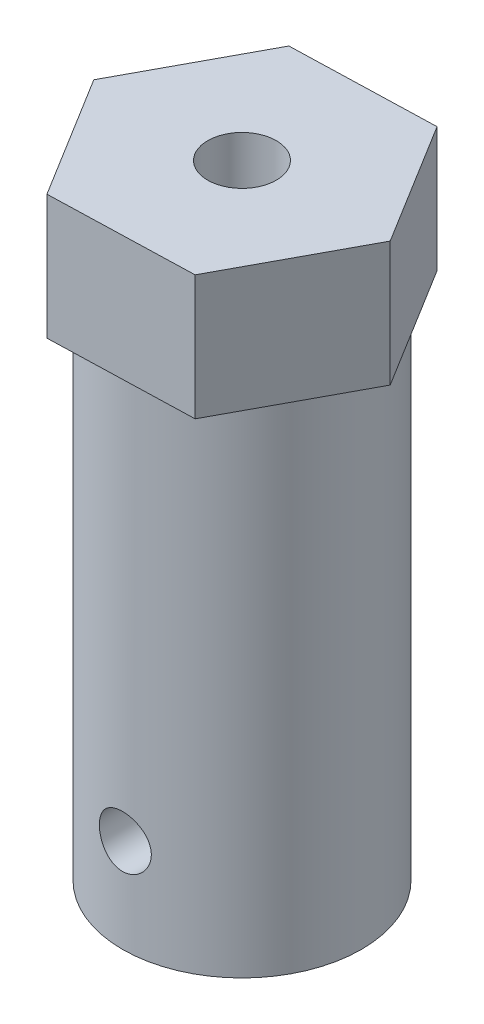
ISO-10303-21;
HEADER;
FILE_DESCRIPTION(('STEP AP214'),'2;1');
FILE_NAME('part.step','',(''),(''),'','','');
FILE_SCHEMA(('AUTOMOTIVE_DESIGN { 1 0 10303 214 1 1 1 1 }'));
ENDSEC;
DATA;
#1=APPLICATION_CONTEXT('core data for automotive mechanical design processes');
#2=APPLICATION_PROTOCOL_DEFINITION('international standard','automotive_design',2000,#1);
#3=PRODUCT_CONTEXT('',#1,'mechanical');
#4=PRODUCT('Part','Part','',(#3));
#5=PRODUCT_RELATED_PRODUCT_CATEGORY('part','',(#4));
#6=PRODUCT_DEFINITION_FORMATION('','',#4);
#7=PRODUCT_DEFINITION_CONTEXT('part definition',#1,'design');
#8=PRODUCT_DEFINITION('design','',#6,#7);
#9=PRODUCT_DEFINITION_SHAPE('','',#8);
#10=(LENGTH_UNIT() NAMED_UNIT(*) SI_UNIT(.MILLI.,.METRE.));
#11=(NAMED_UNIT(*) PLANE_ANGLE_UNIT() SI_UNIT($,.RADIAN.));
#12=(NAMED_UNIT(*) SI_UNIT($,.STERADIAN.) SOLID_ANGLE_UNIT());
#13=UNCERTAINTY_MEASURE_WITH_UNIT(LENGTH_MEASURE(1.E-05),#10,'distance_accuracy_value','');
#14=(GEOMETRIC_REPRESENTATION_CONTEXT(3) GLOBAL_UNCERTAINTY_ASSIGNED_CONTEXT((#13)) GLOBAL_UNIT_ASSIGNED_CONTEXT((#10,
#11,#12)) REPRESENTATION_CONTEXT('',''));
#15=CARTESIAN_POINT('',(0.,0.,0.));
#16=DIRECTION('',(0.,0.,1.));
#17=DIRECTION('',(1.,0.,0.));
#18=AXIS2_PLACEMENT_3D('',#15,#16,#17);
#19=CARTESIAN_POINT('',(0.,0.,0.));
#20=DIRECTION('',(0.,1.,0.));
#21=DIRECTION('',(0.,0.,1.));
#22=AXIS2_PLACEMENT_3D('',#19,#20,#21);
#23=PLANE('',#22);
#24=CARTESIAN_POINT('',(0.,0.,0.));
#25=DIRECTION('',(0.,1.,0.));
#26=DIRECTION('',(0.,0.,1.));
#27=AXIS2_PLACEMENT_3D('',#24,#25,#26);
#28=CIRCLE('',#27,5.75);
#29=CARTESIAN_POINT('',(0.,0.,5.75));
#30=VERTEX_POINT('',#29);
#31=EDGE_CURVE('E55',#30,#30,#28,.T.);
#32=ORIENTED_EDGE('',*,*,#31,.F.);
#33=EDGE_LOOP('',(#32));
#34=FACE_BOUND('',#33,.T.);
#35=CARTESIAN_POINT('',(0.,0.,0.));
#36=DIRECTION('',(0.,1.,0.));
#37=DIRECTION('',(0.,0.,1.));
#38=AXIS2_PLACEMENT_3D('',#35,#36,#37);
#39=CIRCLE('',#38,3.);
#40=CARTESIAN_POINT('',(0.,0.,3.));
#41=VERTEX_POINT('',#40);
#42=EDGE_CURVE('E160',#41,#41,#39,.T.);
#43=ORIENTED_EDGE('',*,*,#42,.T.);
#44=EDGE_LOOP('',(#43));
#45=FACE_BOUND('',#44,.T.);
#46=ADVANCED_FACE('F39',(#34,#45),#23,.F.);
#47=CARTESIAN_POINT('',(0.,24.,0.));
#48=DIRECTION('',(0.,-1.,0.));
#49=DIRECTION('',(0.,0.,-1.));
#50=AXIS2_PLACEMENT_3D('',#47,#48,#49);
#51=CYLINDRICAL_SURFACE('',#50,5.75);
#52=CARTESIAN_POINT('',(1.24999999999999,4.5,5.61248608016091));
#53=CARTESIAN_POINT('',(1.24999760175902,4.43068296184643,5.61248748096109));
#54=CARTESIAN_POINT('',(1.24421457008386,4.36133699814307,5.61378421549666));
#55=CARTESIAN_POINT('',(1.22126011086242,4.22461637882432,5.61882165269733));
#56=CARTESIAN_POINT('',(1.20408038483284,4.15724319703947,5.62256413620073));
#57=CARTESIAN_POINT('',(1.1588984081564,4.02646565959456,5.63204963915259));
#58=CARTESIAN_POINT('',(1.13090794981826,3.96305706663709,5.63779047813056));
#59=CARTESIAN_POINT('',(1.06493269459989,3.8418346268662,5.65062322199733));
#60=CARTESIAN_POINT('',(1.02694812947422,3.78402065036105,5.65771509555576));
#61=CARTESIAN_POINT('',(0.941387199528644,3.67466267604674,5.67258306017403));
#62=CARTESIAN_POINT('',(0.893675607269232,3.62322563850715,5.68036781307722));
#63=CARTESIAN_POINT('',(0.790306917449298,3.52901819345671,5.69566852905388));
#64=CARTESIAN_POINT('',(0.734649207492066,3.48624845453826,5.7031844713546));
#65=CARTESIAN_POINT('',(0.616251730709439,3.41016718516374,5.71719498458548));
#66=CARTESIAN_POINT('',(0.553444449073328,3.37695843887916,5.72367814390655));
#67=CARTESIAN_POINT('',(0.422976308560851,3.32160668166204,5.73479481310162));
#68=CARTESIAN_POINT('',(0.355315988526428,3.2994624443846,5.73942852794901));
#69=CARTESIAN_POINT('',(0.21817438013681,3.26720444923619,5.74626300546532));
#70=CARTESIAN_POINT('',(0.148737517657369,3.25690969698164,5.74850033377872));
#71=CARTESIAN_POINT('',(0.00908864940746421,3.24807709639121,5.75041661094106));
#72=CARTESIAN_POINT('',(-0.0611232678244194,3.2495379187537,5.75009584905479));
#73=CARTESIAN_POINT('',(-0.19908176075318,3.26404001586474,5.74696006103956));
#74=CARTESIAN_POINT('',(-0.26684993862716,3.27688621089837,5.74418705402808));
#75=CARTESIAN_POINT('',(-0.399245052071153,3.31348363834528,5.73650619438593));
#76=CARTESIAN_POINT('',(-0.463871846607452,3.33723535986758,5.7315982460044));
#77=CARTESIAN_POINT('',(-0.588692323977611,3.39514277539871,5.72013127098854));
#78=CARTESIAN_POINT('',(-0.648850497027308,3.42937259876247,5.71356054002011));
#79=CARTESIAN_POINT('',(-0.76264013055773,3.50720931257799,5.69948875500368));
#80=CARTESIAN_POINT('',(-0.816270710503977,3.55081746592165,5.69198757571856));
#81=CARTESIAN_POINT('',(-0.916642826138088,3.64723562771628,5.67669800906149));
#82=CARTESIAN_POINT('',(-0.963220078671666,3.70021637139066,5.6689068874812));
#83=CARTESIAN_POINT('',(-1.04685895715123,3.81331725840589,5.65406013853686));
#84=CARTESIAN_POINT('',(-1.08392033147223,3.87343759047487,5.64700453062468));
#85=CARTESIAN_POINT('',(-1.14754721031011,3.99937447231439,5.63442058541642));
#86=CARTESIAN_POINT('',(-1.17408199706099,4.06520701955582,5.62889673186602));
#87=CARTESIAN_POINT('',(-1.21566278528879,4.20054515048658,5.62006410398923));
#88=CARTESIAN_POINT('',(-1.23071058472624,4.27005015753528,5.61675498301956));
#89=CARTESIAN_POINT('',(-1.2486361117677,4.40925999150907,5.6127970987734));
#90=CARTESIAN_POINT('',(-1.25175290288891,4.47893258539712,5.61209608459876));
#91=CARTESIAN_POINT('',(-1.24637488516898,4.61780186872962,5.61329288738228));
#92=CARTESIAN_POINT('',(-1.2378808635385,4.68699859011844,5.6151905281522));
#93=CARTESIAN_POINT('',(-1.20972965508196,4.82212160819509,5.62132151362112));
#94=CARTESIAN_POINT('',(-1.19020384987401,4.88807663972778,5.62552735254737));
#95=CARTESIAN_POINT('',(-1.14068546407925,5.01577899383204,5.63577608050672));
#96=CARTESIAN_POINT('',(-1.11069189170847,5.07752591703738,5.64181914360333));
#97=CARTESIAN_POINT('',(-1.040561612131,5.19609468941834,5.65517640870419));
#98=CARTESIAN_POINT('',(-1.00027746608422,5.25282726927895,5.66250855855328));
#99=CARTESIAN_POINT('',(-0.910902746534963,5.35881481107359,5.67757037394609));
#100=CARTESIAN_POINT('',(-0.861811093381068,5.40806885489739,5.68530008814152));
#101=CARTESIAN_POINT('',(-0.755133725075515,5.49862751418985,5.70045813036014));
#102=CARTESIAN_POINT('',(-0.697408378720643,5.53976924175179,5.70787829932773));
#103=CARTESIAN_POINT('',(-0.575726899511278,5.61177126760472,5.7214316783188));
#104=CARTESIAN_POINT('',(-0.511771055898407,5.64263204288004,5.72756494804304));
#105=CARTESIAN_POINT('',(-0.379839991982069,5.69296851224918,5.73781903900349));
#106=CARTESIAN_POINT('',(-0.311893120895245,5.71251581946798,5.7419524909196));
#107=CARTESIAN_POINT('',(-0.173580109499774,5.73989437114607,5.74779579806779));
#108=CARTESIAN_POINT('',(-0.103214317857041,5.74772729694571,5.7495060011018));
#109=CARTESIAN_POINT('',(0.0363920861427784,5.75137991384358,5.75029994562711));
#110=CARTESIAN_POINT('',(0.105626141992073,5.74744292595131,5.74943688552911));
#111=CARTESIAN_POINT('',(0.242420679508131,5.72821121185753,5.74529509961069));
#112=CARTESIAN_POINT('',(0.309981190526998,5.7129166850005,5.74201641618866));
#113=CARTESIAN_POINT('',(0.441325345429479,5.67152004722863,5.73341553673506));
#114=CARTESIAN_POINT('',(0.505120193765912,5.64545205938541,5.72809979656158));
#115=CARTESIAN_POINT('',(0.627463117633281,5.58328189579532,5.71599278629122));
#116=CARTESIAN_POINT('',(0.686010689871312,5.54717875888551,5.70920137486869));
#117=CARTESIAN_POINT('',(0.797385198849451,5.465167704943,5.69472504901097));
#118=CARTESIAN_POINT('',(0.850084117233428,5.41908845582244,5.68702575501951));
#119=CARTESIAN_POINT('',(0.947084699131781,5.31877927382973,5.67167946381507));
#120=CARTESIAN_POINT('',(0.991384338610196,5.2645473819859,5.66403247963441));
#121=CARTESIAN_POINT('',(1.07089047065235,5.14861342572913,5.64954445311031));
#122=CARTESIAN_POINT('',(1.10596950268022,5.08682237378893,5.64271535335214));
#123=CARTESIAN_POINT('',(1.16518968031949,4.95808718086018,5.63078614292552));
#124=CARTESIAN_POINT('',(1.18934013275368,4.8911474815424,5.62568456203052));
#125=CARTESIAN_POINT('',(1.2216782905918,4.7701109875964,5.61873681728447));
#126=CARTESIAN_POINT('',(1.2322786662895,4.7166733902261,5.61640827090507));
#127=CARTESIAN_POINT('',(1.24644029510223,4.60882977483622,5.61328238883723));
#128=CARTESIAN_POINT('',(1.25000188296265,4.55442380299405,5.61248498033214));
#129=CARTESIAN_POINT('',(1.24999999999999,4.5,5.61248608016091));
#130=B_SPLINE_CURVE_WITH_KNOTS('',3,(#52,#53,#54,#55,#56,#57,#58,#59,#60,#61,#62,#63,#64,#65,
#66,#67,#68,#69,#70,#71,#72,#73,#74,#75,#76,#77,#78,#79,#80,#81,#82,#83,#84,#85,#86,#87,#88,#89,
#90,#91,#92,#93,#94,#95,#96,#97,#98,#99,#100,#101,#102,#103,#104,#105,#106,#107,#108,#109,#110,
#111,#112,#113,#114,#115,#116,#117,#118,#119,#120,#121,#122,#123,#124,#125,#126,#127,#128,#129),
.UNSPECIFIED.,.T.,.F.,(4,2,2,2,2,2,2,2,2,2,2,2,2,2,2,2,2,2,2,2,2,2,2,2,2,2,2,2,2,2,2,2,2,2,2,2,
2,2,4),(0.,0.207751669325756,0.415654778957708,0.623331746184184,0.831003897988611,
1.04178860079159,1.25258955726905,1.46557862294375,1.67854407654251,1.88821152973921,
2.09785527440792,2.30397491643876,2.51010380376594,2.71772608059428,2.92537633349732,
3.13729528259188,3.34921983480672,3.56175833620002,3.77426356392283,3.98248779787275,
4.19069791496372,4.3964791236714,4.60227983471728,4.811213017446,5.02017182937093,
5.23297426277709,5.44576682184841,5.65719726336087,5.86859735579661,6.07565757195403,
6.28271415393183,6.48911988588624,6.69554539412311,6.90584589920715,7.11619701771825,
7.32931887187706,7.5422588874553,7.70538146128842,7.86849627727378),.UNSPECIFIED.);
#131=CARTESIAN_POINT('',(1.24999999999999,4.5,5.61248608016091));
#132=VERTEX_POINT('',#131);
#133=EDGE_CURVE('E154',#132,#132,#130,.T.);
#134=ORIENTED_EDGE('',*,*,#133,.T.);
#135=EDGE_LOOP('',(#134));
#136=FACE_BOUND('',#135,.T.);
#137=CARTESIAN_POINT('',(0.,24.,0.));
#138=DIRECTION('',(0.,1.,0.));
#139=DIRECTION('',(0.,0.,1.));
#140=AXIS2_PLACEMENT_3D('',#137,#138,#139);
#141=CIRCLE('',#140,5.75);
#142=CARTESIAN_POINT('',(0.,24.,5.75));
#143=VERTEX_POINT('',#142);
#144=EDGE_CURVE('E11',#143,#143,#141,.T.);
#145=ORIENTED_EDGE('',*,*,#144,.F.);
#146=EDGE_LOOP('',(#145));
#147=FACE_BOUND('',#146,.T.);
#148=ORIENTED_EDGE('',*,*,#31,.T.);
#149=EDGE_LOOP('',(#148));
#150=FACE_BOUND('',#149,.T.);
#151=ADVANCED_FACE('F41',(#136,#147,#150),#51,.T.);
#152=CARTESIAN_POINT('',(0.,24.,0.));
#153=DIRECTION('',(0.,-1.,0.));
#154=DIRECTION('',(0.,0.,-1.));
#155=AXIS2_PLACEMENT_3D('',#152,#153,#154);
#156=CYLINDRICAL_SURFACE('',#155,3.);
#157=CARTESIAN_POINT('',(1.24999999999999,4.5,2.72717802865893));
#158=CARTESIAN_POINT('',(1.24999259066567,4.43332810910315,2.7271851956322));
#159=CARTESIAN_POINT('',(1.24463203881502,4.36654734317378,2.72965859534401));
#160=CARTESIAN_POINT('',(1.22339678947784,4.23491305794286,2.73923833650884));
#161=CARTESIAN_POINT('',(1.20749354003276,4.17006527332477,2.74635725824267));
#162=CARTESIAN_POINT('',(1.1658998841945,4.04443887030893,2.76426917574768));
#163=CARTESIAN_POINT('',(1.14024937431427,3.98364483628499,2.77504717562616));
#164=CARTESIAN_POINT('',(1.08000637754462,3.86724055042195,2.79904148565793));
#165=CARTESIAN_POINT('',(1.04541600591531,3.81162907656688,2.81225721880783));
#166=CARTESIAN_POINT('',(0.965973882676161,3.70367427502653,2.84055762619857));
#167=CARTESIAN_POINT('',(0.920653238184404,3.65169244125591,2.85570568079146));
#168=CARTESIAN_POINT('',(0.822021675745545,3.55579977750245,2.88564295372227));
#169=CARTESIAN_POINT('',(0.768707691374,3.51189205938699,2.90043203180789));
#170=CARTESIAN_POINT('',(0.652763393797344,3.43155046912073,2.92875537930613));
#171=CARTESIAN_POINT('',(0.589829293683656,3.39552337196766,2.94220739975291));
#172=CARTESIAN_POINT('',(0.45813202236235,3.3347239794944,2.96556519993426));
#173=CARTESIAN_POINT('',(0.389371454872122,3.30994668803579,2.97547255347157));
#174=CARTESIAN_POINT('',(0.251768498025164,3.27366054124327,2.99017521042367));
#175=CARTESIAN_POINT('',(0.183116576196079,3.26152830509796,2.99520971127466));
#176=CARTESIAN_POINT('',(0.0445791803650056,3.24886235884015,3.00046828611204));
#177=CARTESIAN_POINT('',(-0.0253057817645166,3.24832394411705,3.00069431131015));
#178=CARTESIAN_POINT('',(-0.159792780112568,3.25853428093333,2.99645129133057));
#179=CARTESIAN_POINT('',(-0.224457488607313,3.26859810052573,2.99226714648664));
#180=CARTESIAN_POINT('',(-0.351082893931455,3.29855310263817,2.98006516750309));
#181=CARTESIAN_POINT('',(-0.413043391054915,3.31844500963017,2.97204705074577));
#182=CARTESIAN_POINT('',(-0.533638118077523,3.36772804089465,2.95279852414029));
#183=CARTESIAN_POINT('',(-0.592207177074904,3.39725946287083,2.94152097126085));
#184=CARTESIAN_POINT('',(-0.70371176728196,3.46484575670035,2.91685713989805));
#185=CARTESIAN_POINT('',(-0.756645297756971,3.50290364084499,2.90347011666255));
#186=CARTESIAN_POINT('',(-0.85934091170792,3.58958242040462,2.87481698777061));
#187=CARTESIAN_POINT('',(-0.908616437316237,3.63875879127901,2.8594849435601));
#188=CARTESIAN_POINT('',(-0.998431414927664,3.74471144070658,2.8293786068147));
#189=CARTESIAN_POINT('',(-1.03896749582431,3.8014906382921,2.8146045313137));
#190=CARTESIAN_POINT('',(-1.11140189250063,3.92339503666191,2.78681612355339));
#191=CARTESIAN_POINT('',(-1.1429725335554,3.98873320574328,2.77387558556715));
#192=CARTESIAN_POINT('',(-1.19446432058391,4.1244810449745,2.75209844221011));
#193=CARTESIAN_POINT('',(-1.21439379627313,4.19488704826955,2.74325890334594));
#194=CARTESIAN_POINT('',(-1.24080025168121,4.333896808914,2.73141212519724));
#195=CARTESIAN_POINT('',(-1.24806614632865,4.40232112225905,2.72806369197117));
#196=CARTESIAN_POINT('',(-1.25125630518998,4.5394784824115,2.72660286810642));
#197=CARTESIAN_POINT('',(-1.24718449318148,4.60821141419171,2.72848866599319));
#198=CARTESIAN_POINT('',(-1.22853477565555,4.73939838543045,2.73693131345749));
#199=CARTESIAN_POINT('',(-1.21464618818048,4.8019726867868,2.74318138016618));
#200=CARTESIAN_POINT('',(-1.17767058564225,4.92385129649787,2.75925630297447));
#201=CARTESIAN_POINT('',(-1.15458142053124,4.98315483683071,2.76908199460161));
#202=CARTESIAN_POINT('',(-1.09877520805186,5.09961531035646,2.79170797857));
#203=CARTESIAN_POINT('',(-1.06569183306197,5.15657497461032,2.80461662202282));
#204=CARTESIAN_POINT('',(-0.991200784385965,5.26440805249902,2.83180003740794));
#205=CARTESIAN_POINT('',(-0.949789507875982,5.31527881670186,2.84607539920583));
#206=CARTESIAN_POINT('',(-0.855844455715499,5.413800134884,2.87578619784533));
#207=CARTESIAN_POINT('',(-0.802679661479733,5.46085139995065,2.89122146708842));
#208=CARTESIAN_POINT('',(-0.688851512553535,5.54547229197933,2.92043361183923));
#209=CARTESIAN_POINT('',(-0.628187608803652,5.5830412240637,2.93421036577014));
#210=CARTESIAN_POINT('',(-0.500654680803381,5.64758987544357,2.9586425158565));
#211=CARTESIAN_POINT('',(-0.433770169638503,5.67454224128947,2.96928983138826));
#212=CARTESIAN_POINT('',(-0.295858835154415,5.71661679233442,2.98618173103366));
#213=CARTESIAN_POINT('',(-0.224834504225193,5.73174601822606,2.9924289351992));
#214=CARTESIAN_POINT('',(-0.08601653350641,5.7488581255203,2.9995153479751));
#215=CARTESIAN_POINT('',(-0.0183440847938972,5.75168599969696,3.00070204534225));
#216=CARTESIAN_POINT('',(0.116486811714285,5.74638685870605,2.99849523480953));
#217=CARTESIAN_POINT('',(0.183645347541155,5.73826176398713,2.99510252984313));
#218=CARTESIAN_POINT('',(0.313086482449184,5.71189392784133,2.98430065981734));
#219=CARTESIAN_POINT('',(0.375457537843568,5.69402031953044,2.97703824209233));
#220=CARTESIAN_POINT('',(0.496292230501329,5.64906575279086,2.95929499847058));
#221=CARTESIAN_POINT('',(0.554755122985825,5.62198304533509,2.94881356124207));
#222=CARTESIAN_POINT('',(0.66902456547878,5.55801047078553,2.92505825398663));
#223=CARTESIAN_POINT('',(0.72459165797668,5.520732698576,2.91167959188766));
#224=CARTESIAN_POINT('',(0.828918675638779,5.4379928171281,2.88371561874231));
#225=CARTESIAN_POINT('',(0.877676061786039,5.39252766959324,2.86912986083797));
#226=CARTESIAN_POINT('',(0.970449787231577,5.29105517414559,2.83914845259141));
#227=CARTESIAN_POINT('',(1.01391775364847,5.23454098537887,2.82376522857896));
#228=CARTESIAN_POINT('',(1.09083332306674,5.1145412593198,2.79495552690186));
#229=CARTESIAN_POINT('',(1.12427532456754,5.05105185194185,2.78153014522558));
#230=CARTESIAN_POINT('',(1.17982766043577,4.91905616497725,2.75842557732643));
#231=CARTESIAN_POINT('',(1.20199823632853,4.85057884120679,2.74872654469865));
#232=CARTESIAN_POINT('',(1.234235564538,4.71046042614933,2.73440803066668));
#233=CARTESIAN_POINT('',(1.24434291521209,4.6388307927257,2.72977151604981));
#234=CARTESIAN_POINT('',(1.24940464923649,4.54464147573811,2.72744979732688));
#235=CARTESIAN_POINT('',(1.25000248121118,4.52232684261196,2.72717562860875));
#236=CARTESIAN_POINT('',(1.24999999999999,4.5,2.72717802865893));
#237=B_SPLINE_CURVE_WITH_KNOTS('',3,(#157,#158,#159,#160,#161,#162,#163,#164,#165,#166,#167,
#168,#169,#170,#171,#172,#173,#174,#175,#176,#177,#178,#179,#180,#181,#182,#183,#184,#185,#186,
#187,#188,#189,#190,#191,#192,#193,#194,#195,#196,#197,#198,#199,#200,#201,#202,#203,#204,#205,
#206,#207,#208,#209,#210,#211,#212,#213,#214,#215,#216,#217,#218,#219,#220,#221,#222,#223,#224,
#225,#226,#227,#228,#229,#230,#231,#232,#233,#234,#235,#236),.UNSPECIFIED.,.T.,.F.,(4,2,2,2,2,2,
2,2,2,2,2,2,2,2,2,2,2,2,2,2,2,2,2,2,2,2,2,2,2,2,2,2,2,2,2,2,2,2,2,4),(0.,0.199951711985514,
0.400447161842174,0.600130652152109,0.799766938550096,1.01066841430653,1.2216510045991,
1.44178476577923,1.6618206677489,1.87040605977951,2.07890680917929,2.27471840245092,
2.47054443201882,2.66935814640064,2.86824221022483,3.08114531844483,3.29413040441365,
3.5141154566672,3.73394290745567,3.93950778306306,4.14500152518447,4.3373390106619,
4.52972146913527,4.73025126818167,4.93086800795463,5.14781662735511,5.36478114041864,
5.58230105955592,5.79969134643005,6.0018863509405,6.20404590801911,6.39903415036485,
6.59405944632169,6.79789862829034,7.00181361048901,7.21960426908074,7.43751638139185,
7.65425125796861,7.87025464546159,7.93721375436702),.UNSPECIFIED.);
#238=CARTESIAN_POINT('',(1.24999999999999,4.5,2.72717802865893));
#239=VERTEX_POINT('',#238);
#240=EDGE_CURVE('E44',#239,#239,#237,.T.);
#241=ORIENTED_EDGE('',*,*,#240,.F.);
#242=EDGE_LOOP('',(#241));
#243=FACE_BOUND('',#242,.T.);
#244=CARTESIAN_POINT('',(0.,24.,0.));
#245=DIRECTION('',(0.,1.,0.));
#246=DIRECTION('',(0.,0.,1.));
#247=AXIS2_PLACEMENT_3D('',#244,#245,#246);
#248=CIRCLE('',#247,3.);
#249=CARTESIAN_POINT('',(0.,24.,3.));
#250=VERTEX_POINT('',#249);
#251=EDGE_CURVE('E153',#250,#250,#248,.T.);
#252=ORIENTED_EDGE('',*,*,#251,.T.);
#253=EDGE_LOOP('',(#252));
#254=FACE_BOUND('',#253,.T.);
#255=ORIENTED_EDGE('',*,*,#42,.F.);
#256=EDGE_LOOP('',(#255));
#257=FACE_BOUND('',#256,.T.);
#258=ADVANCED_FACE('F167',(#243,#254,#257),#156,.F.);
#259=CARTESIAN_POINT('',(0.,4.5,5.75));
#260=DIRECTION('',(0.,0.,1.));
#261=DIRECTION('',(1.,0.,0.));
#262=AXIS2_PLACEMENT_3D('',#259,#260,#261);
#263=CYLINDRICAL_SURFACE('',#262,1.24999999999999);
#264=ORIENTED_EDGE('',*,*,#240,.T.);
#265=EDGE_LOOP('',(#264));
#266=FACE_BOUND('',#265,.T.);
#267=ORIENTED_EDGE('',*,*,#133,.F.);
#268=EDGE_LOOP('',(#267));
#269=FACE_BOUND('',#268,.T.);
#270=ADVANCED_FACE('F162',(#266,#269),#263,.F.);
#271=CARTESIAN_POINT('',(0.,24.,0.));
#272=DIRECTION('',(0.,1.,0.));
#273=DIRECTION('',(0.,0.,1.));
#274=AXIS2_PLACEMENT_3D('',#271,#272,#273);
#275=PLANE('',#274);
#276=CARTESIAN_POINT('',(0.,24.,0.));
#277=DIRECTION('',(0.,1.,0.));
#278=DIRECTION('',(0.,0.,1.));
#279=AXIS2_PLACEMENT_3D('',#276,#277,#278);
#280=CIRCLE('',#279,1.65);
#281=CARTESIAN_POINT('',(0.,24.,1.65));
#282=VERTEX_POINT('',#281);
#283=EDGE_CURVE('E137',#282,#282,#280,.T.);
#284=ORIENTED_EDGE('',*,*,#283,.T.);
#285=EDGE_LOOP('',(#284));
#286=FACE_BOUND('',#285,.T.);
#287=ORIENTED_EDGE('',*,*,#251,.F.);
#288=EDGE_LOOP('',(#287));
#289=FACE_BOUND('',#288,.T.);
#290=ADVANCED_FACE('F166',(#286,#289),#275,.F.);
#291=CARTESIAN_POINT('',(3.63977307715083,30.,5.89508710256668));
#292=DIRECTION('',(-0.880412900339249,0.,-0.474207892085561));
#293=DIRECTION('',(-0.474207892085561,0.,0.880412900339249));
#294=AXIS2_PLACEMENT_3D('',#291,#292,#293);
#295=PLANE('',#294);
#296=DIRECTION('',(0.474207892085561,0.,-0.880412900339249));
#297=VECTOR('',#296,1.);
#298=CARTESIAN_POINT('',(3.63977307715083,24.,5.89508710256668));
#299=LINE('',#298,#297);
#300=CARTESIAN_POINT('',(3.63977307715083,24.,5.89508710256668));
#301=VERTEX_POINT('',#300);
#302=CARTESIAN_POINT('',(6.92518172692016,24.,-0.204592397539939));
#303=VERTEX_POINT('',#302);
#304=EDGE_CURVE('E133',#301,#303,#299,.T.);
#305=ORIENTED_EDGE('',*,*,#304,.T.);
#306=DIRECTION('',(0.,-1.,0.));
#307=VECTOR('',#306,1.);
#308=CARTESIAN_POINT('',(6.92518172692016,30.,-0.204592397539939));
#309=LINE('',#308,#307);
#310=CARTESIAN_POINT('',(6.92518172692016,30.,-0.204592397539939));
#311=VERTEX_POINT('',#310);
#312=EDGE_CURVE('E151',#311,#303,#309,.T.);
#313=ORIENTED_EDGE('',*,*,#312,.F.);
#314=DIRECTION('',(0.474207892085561,0.,-0.880412900339249));
#315=VECTOR('',#314,1.);
#316=CARTESIAN_POINT('',(3.63977307715083,30.,5.89508710256668));
#317=LINE('',#316,#315);
#318=CARTESIAN_POINT('',(3.63977307715083,30.,5.89508710256668));
#319=VERTEX_POINT('',#318);
#320=EDGE_CURVE('E144',#319,#311,#317,.T.);
#321=ORIENTED_EDGE('',*,*,#320,.F.);
#322=DIRECTION('',(0.,-1.,0.));
#323=VECTOR('',#322,1.);
#324=CARTESIAN_POINT('',(3.63977307715083,30.,5.89508710256668));
#325=LINE('',#324,#323);
#326=EDGE_CURVE('E129',#319,#301,#325,.T.);
#327=ORIENTED_EDGE('',*,*,#326,.T.);
#328=EDGE_LOOP('',(#305,#313,#321,#327));
#329=FACE_BOUND('',#328,.T.);
#330=ADVANCED_FACE('F169',(#329),#295,.F.);
#331=CARTESIAN_POINT('',(6.92518172692016,30.,-0.204592397539939));
#332=DIRECTION('',(-0.85088253139079,0.,0.525355991470546));
#333=DIRECTION('',(0.525355991470546,0.,0.85088253139079));
#334=AXIS2_PLACEMENT_3D('',#331,#332,#333);
#335=PLANE('',#334);
#336=DIRECTION('',(-0.525355991470546,0.,-0.85088253139079));
#337=VECTOR('',#336,1.);
#338=CARTESIAN_POINT('',(6.92518172692016,24.,-0.204592397539939));
#339=LINE('',#338,#337);
#340=CARTESIAN_POINT('',(3.28540864976933,24.,-6.09967950010662));
#341=VERTEX_POINT('',#340);
#342=EDGE_CURVE('E136',#303,#341,#339,.T.);
#343=ORIENTED_EDGE('',*,*,#342,.T.);
#344=DIRECTION('',(0.,-1.,0.));
#345=VECTOR('',#344,1.);
#346=CARTESIAN_POINT('',(3.28540864976933,30.,-6.09967950010662));
#347=LINE('',#346,#345);
#348=CARTESIAN_POINT('',(3.28540864976933,30.,-6.09967950010662));
#349=VERTEX_POINT('',#348);
#350=EDGE_CURVE('E148',#349,#341,#347,.T.);
#351=ORIENTED_EDGE('',*,*,#350,.F.);
#352=DIRECTION('',(-0.525355991470546,0.,-0.85088253139079));
#353=VECTOR('',#352,1.);
#354=CARTESIAN_POINT('',(6.92518172692016,30.,-0.204592397539939));
#355=LINE('',#354,#353);
#356=EDGE_CURVE('E102',#311,#349,#355,.T.);
#357=ORIENTED_EDGE('',*,*,#356,.F.);
#358=ORIENTED_EDGE('',*,*,#312,.T.);
#359=EDGE_LOOP('',(#343,#351,#357,#358));
#360=FACE_BOUND('',#359,.T.);
#361=ADVANCED_FACE('F219',(#360),#335,.F.);
#362=CARTESIAN_POINT('',(3.28540864976933,30.,-6.09967950010662));
#363=DIRECTION('',(0.029530368948459,0.,0.999563883556107));
#364=DIRECTION('',(0.999563883556108,0.,-0.029530368948459));
#365=AXIS2_PLACEMENT_3D('',#362,#363,#364);
#366=PLANE('',#365);
#367=DIRECTION('',(-0.999563883556108,0.,0.029530368948459));
#368=VECTOR('',#367,1.);
#369=CARTESIAN_POINT('',(3.28540864976933,24.,-6.09967950010662));
#370=LINE('',#369,#368);
#371=CARTESIAN_POINT('',(-3.63977307715083,24.,-5.89508710256668));
#372=VERTEX_POINT('',#371);
#373=EDGE_CURVE('E139',#341,#372,#370,.T.);
#374=ORIENTED_EDGE('',*,*,#373,.T.);
#375=DIRECTION('',(0.,-1.,0.));
#376=VECTOR('',#375,1.);
#377=CARTESIAN_POINT('',(-3.63977307715083,30.,-5.89508710256668));
#378=LINE('',#377,#376);
#379=CARTESIAN_POINT('',(-3.63977307715083,30.,-5.89508710256668));
#380=VERTEX_POINT('',#379);
#381=EDGE_CURVE('E124',#380,#372,#378,.T.);
#382=ORIENTED_EDGE('',*,*,#381,.F.);
#383=DIRECTION('',(-0.999563883556108,0.,0.029530368948459));
#384=VECTOR('',#383,1.);
#385=CARTESIAN_POINT('',(3.28540864976933,30.,-6.09967950010662));
#386=LINE('',#385,#384);
#387=EDGE_CURVE('E115',#349,#380,#386,.T.);
#388=ORIENTED_EDGE('',*,*,#387,.F.);
#389=ORIENTED_EDGE('',*,*,#350,.T.);
#390=EDGE_LOOP('',(#374,#382,#388,#389));
#391=FACE_BOUND('',#390,.T.);
#392=ADVANCED_FACE('F217',(#391),#366,.F.);
#393=CARTESIAN_POINT('',(-3.63977307715083,30.,-5.89508710256668));
#394=DIRECTION('',(0.880412900339249,0.,0.474207892085561));
#395=DIRECTION('',(0.474207892085561,0.,-0.880412900339249));
#396=AXIS2_PLACEMENT_3D('',#393,#394,#395);
#397=PLANE('',#396);
#398=DIRECTION('',(-0.474207892085561,0.,0.880412900339249));
#399=VECTOR('',#398,1.);
#400=CARTESIAN_POINT('',(-3.63977307715083,24.,-5.89508710256668));
#401=LINE('',#400,#399);
#402=CARTESIAN_POINT('',(-6.92518172692016,24.,0.204592397539942));
#403=VERTEX_POINT('',#402);
#404=EDGE_CURVE('E123',#372,#403,#401,.T.);
#405=ORIENTED_EDGE('',*,*,#404,.T.);
#406=DIRECTION('',(0.,-1.,0.));
#407=VECTOR('',#406,1.);
#408=CARTESIAN_POINT('',(-6.92518172692016,30.,0.204592397539942));
#409=LINE('',#408,#407);
#410=CARTESIAN_POINT('',(-6.92518172692016,30.,0.204592397539942));
#411=VERTEX_POINT('',#410);
#412=EDGE_CURVE('E120',#411,#403,#409,.T.);
#413=ORIENTED_EDGE('',*,*,#412,.F.);
#414=DIRECTION('',(-0.474207892085561,0.,0.880412900339249));
#415=VECTOR('',#414,1.);
#416=CARTESIAN_POINT('',(-3.63977307715083,30.,-5.89508710256668));
#417=LINE('',#416,#415);
#418=EDGE_CURVE('E109',#380,#411,#417,.T.);
#419=ORIENTED_EDGE('',*,*,#418,.F.);
#420=ORIENTED_EDGE('',*,*,#381,.T.);
#421=EDGE_LOOP('',(#405,#413,#419,#420));
#422=FACE_BOUND('',#421,.T.);
#423=ADVANCED_FACE('F121',(#422),#397,.F.);
#424=CARTESIAN_POINT('',(-6.92518172692016,30.,0.204592397539942));
#425=DIRECTION('',(0.85088253139079,0.,-0.525355991470546));
#426=DIRECTION('',(-0.525355991470546,0.,-0.85088253139079));
#427=AXIS2_PLACEMENT_3D('',#424,#425,#426);
#428=PLANE('',#427);
#429=DIRECTION('',(0.525355991470546,0.,0.85088253139079));
#430=VECTOR('',#429,1.);
#431=CARTESIAN_POINT('',(-6.92518172692016,24.,0.204592397539942));
#432=LINE('',#431,#430);
#433=CARTESIAN_POINT('',(-3.28540864976933,24.,6.09967950010662));
#434=VERTEX_POINT('',#433);
#435=EDGE_CURVE('E87',#403,#434,#432,.T.);
#436=ORIENTED_EDGE('',*,*,#435,.T.);
#437=DIRECTION('',(0.,-1.,0.));
#438=VECTOR('',#437,1.);
#439=CARTESIAN_POINT('',(-3.28540864976933,30.,6.09967950010662));
#440=LINE('',#439,#438);
#441=CARTESIAN_POINT('',(-3.28540864976933,30.,6.09967950010662));
#442=VERTEX_POINT('',#441);
#443=EDGE_CURVE('E125',#442,#434,#440,.T.);
#444=ORIENTED_EDGE('',*,*,#443,.F.);
#445=DIRECTION('',(0.525355991470546,0.,0.85088253139079));
#446=VECTOR('',#445,1.);
#447=CARTESIAN_POINT('',(-6.92518172692016,30.,0.204592397539942));
#448=LINE('',#447,#446);
#449=EDGE_CURVE('E113',#411,#442,#448,.T.);
#450=ORIENTED_EDGE('',*,*,#449,.F.);
#451=ORIENTED_EDGE('',*,*,#412,.T.);
#452=EDGE_LOOP('',(#436,#444,#450,#451));
#453=FACE_BOUND('',#452,.T.);
#454=ADVANCED_FACE('F127',(#453),#428,.F.);
#455=CARTESIAN_POINT('',(-3.28540864976933,30.,6.09967950010662));
#456=DIRECTION('',(-0.0295303689484587,0.,-0.999563883556108));
#457=DIRECTION('',(-0.999563883556108,0.,0.0295303689484587));
#458=AXIS2_PLACEMENT_3D('',#455,#456,#457);
#459=PLANE('',#458);
#460=DIRECTION('',(0.999563883556108,0.,-0.0295303689484587));
#461=VECTOR('',#460,1.);
#462=CARTESIAN_POINT('',(-3.28540864976933,24.,6.09967950010662));
#463=LINE('',#462,#461);
#464=EDGE_CURVE('E93',#434,#301,#463,.T.);
#465=ORIENTED_EDGE('',*,*,#464,.T.);
#466=ORIENTED_EDGE('',*,*,#326,.F.);
#467=DIRECTION('',(0.999563883556108,0.,-0.0295303689484587));
#468=VECTOR('',#467,1.);
#469=CARTESIAN_POINT('',(-3.28540864976933,30.,6.09967950010662));
#470=LINE('',#469,#468);
#471=EDGE_CURVE('E64',#442,#319,#470,.T.);
#472=ORIENTED_EDGE('',*,*,#471,.F.);
#473=ORIENTED_EDGE('',*,*,#443,.T.);
#474=EDGE_LOOP('',(#465,#466,#472,#473));
#475=FACE_BOUND('',#474,.T.);
#476=ADVANCED_FACE('F204',(#475),#459,.F.);
#477=CARTESIAN_POINT('',(0.,30.,0.));
#478=DIRECTION('',(0.,1.,0.));
#479=DIRECTION('',(0.,0.,1.));
#480=AXIS2_PLACEMENT_3D('',#477,#478,#479);
#481=PLANE('',#480);
#482=CARTESIAN_POINT('',(0.,30.,0.));
#483=DIRECTION('',(0.,1.,0.));
#484=DIRECTION('',(0.,0.,1.));
#485=AXIS2_PLACEMENT_3D('',#482,#483,#484);
#486=CIRCLE('',#485,1.65);
#487=CARTESIAN_POINT('',(0.,30.,1.65));
#488=VERTEX_POINT('',#487);
#489=EDGE_CURVE('E230',#488,#488,#486,.T.);
#490=ORIENTED_EDGE('',*,*,#489,.F.);
#491=EDGE_LOOP('',(#490));
#492=FACE_BOUND('',#491,.T.);
#493=ORIENTED_EDGE('',*,*,#320,.T.);
#494=ORIENTED_EDGE('',*,*,#356,.T.);
#495=ORIENTED_EDGE('',*,*,#387,.T.);
#496=ORIENTED_EDGE('',*,*,#418,.T.);
#497=ORIENTED_EDGE('',*,*,#449,.T.);
#498=ORIENTED_EDGE('',*,*,#471,.T.);
#499=EDGE_LOOP('',(#493,#494,#495,#496,#497,#498));
#500=FACE_BOUND('',#499,.T.);
#501=ADVANCED_FACE('F111',(#492,#500),#481,.T.);
#502=ORIENTED_EDGE('',*,*,#144,.T.);
#503=EDGE_LOOP('',(#502));
#504=FACE_BOUND('',#503,.T.);
#505=ORIENTED_EDGE('',*,*,#304,.F.);
#506=ORIENTED_EDGE('',*,*,#464,.F.);
#507=ORIENTED_EDGE('',*,*,#435,.F.);
#508=ORIENTED_EDGE('',*,*,#404,.F.);
#509=ORIENTED_EDGE('',*,*,#373,.F.);
#510=ORIENTED_EDGE('',*,*,#342,.F.);
#511=EDGE_LOOP('',(#505,#506,#507,#508,#509,#510));
#512=FACE_BOUND('',#511,.T.);
#513=ADVANCED_FACE('F194',(#504,#512),#275,.F.);
#514=CARTESIAN_POINT('',(0.,30.,0.));
#515=DIRECTION('',(0.,1.,0.));
#516=DIRECTION('',(0.,0.,1.));
#517=AXIS2_PLACEMENT_3D('',#514,#515,#516);
#518=CYLINDRICAL_SURFACE('',#517,1.65);
#519=ORIENTED_EDGE('',*,*,#489,.T.);
#520=EDGE_LOOP('',(#519));
#521=FACE_BOUND('',#520,.T.);
#522=ORIENTED_EDGE('',*,*,#283,.F.);
#523=EDGE_LOOP('',(#522));
#524=FACE_BOUND('',#523,.T.);
#525=ADVANCED_FACE('F197',(#521,#524),#518,.F.);
#526=CLOSED_SHELL('',(#46,#151,#258,#270,#290,#330,#361,#392,#423,#454,#476,#501,#513,#525));
#527=MANIFOLD_SOLID_BREP('B2',#526);
#528=ADVANCED_BREP_SHAPE_REPRESENTATION('',(#18,#527),#14);
#529=SHAPE_DEFINITION_REPRESENTATION(#9,#528);
ENDSEC;
END-ISO-10303-21;
